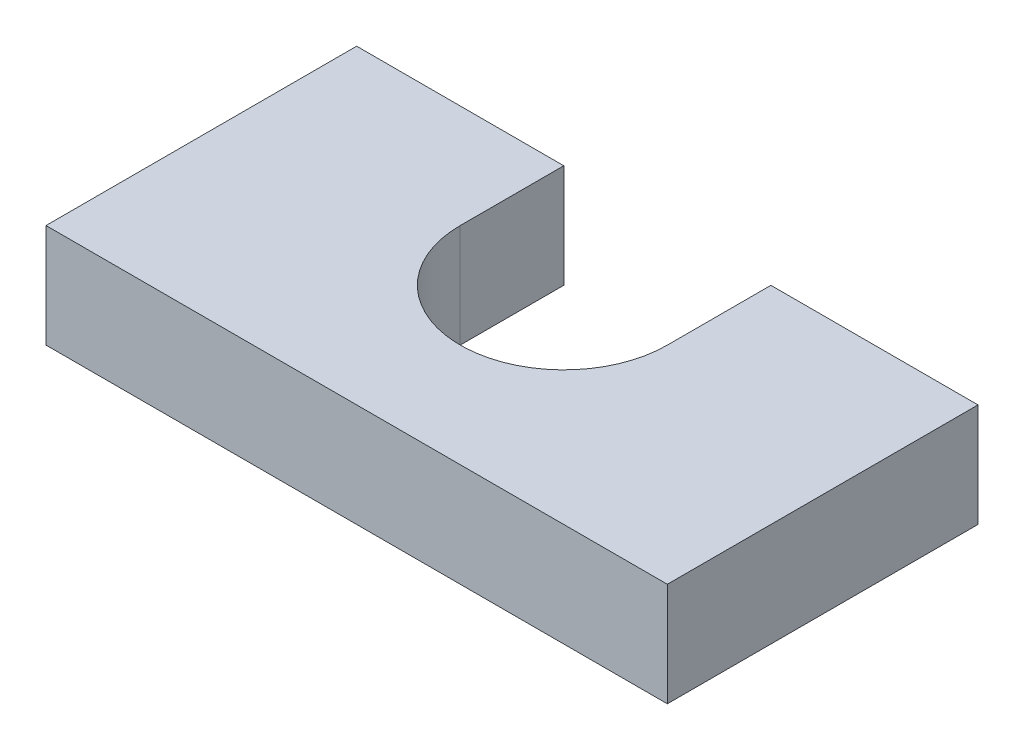
ISO-10303-21;
HEADER;
FILE_DESCRIPTION(('STEP AP214'),'2;1');
FILE_NAME('part.step','',(''),(''),'','','');
FILE_SCHEMA(('AUTOMOTIVE_DESIGN { 1 0 10303 214 1 1 1 1 }'));
ENDSEC;
DATA;
#1=APPLICATION_CONTEXT('core data for automotive mechanical design processes');
#2=APPLICATION_PROTOCOL_DEFINITION('international standard','automotive_design',2000,#1);
#3=PRODUCT_CONTEXT('',#1,'mechanical');
#4=PRODUCT('Part','Part','',(#3));
#5=PRODUCT_RELATED_PRODUCT_CATEGORY('part','',(#4));
#6=PRODUCT_DEFINITION_FORMATION('','',#4);
#7=PRODUCT_DEFINITION_CONTEXT('part definition',#1,'design');
#8=PRODUCT_DEFINITION('design','',#6,#7);
#9=PRODUCT_DEFINITION_SHAPE('','',#8);
#10=(LENGTH_UNIT() NAMED_UNIT(*) SI_UNIT(.MILLI.,.METRE.));
#11=(NAMED_UNIT(*) PLANE_ANGLE_UNIT() SI_UNIT($,.RADIAN.));
#12=(NAMED_UNIT(*) SI_UNIT($,.STERADIAN.) SOLID_ANGLE_UNIT());
#13=UNCERTAINTY_MEASURE_WITH_UNIT(LENGTH_MEASURE(1.E-05),#10,'distance_accuracy_value','');
#14=(GEOMETRIC_REPRESENTATION_CONTEXT(3) GLOBAL_UNCERTAINTY_ASSIGNED_CONTEXT((#13)) GLOBAL_UNIT_ASSIGNED_CONTEXT((#10,
#11,#12)) REPRESENTATION_CONTEXT('',''));
#15=CARTESIAN_POINT('',(0.,0.,0.));
#16=DIRECTION('',(0.,0.,1.));
#17=DIRECTION('',(1.,0.,0.));
#18=AXIS2_PLACEMENT_3D('',#15,#16,#17);
#19=CARTESIAN_POINT('',(-60.,20.,0.));
#20=DIRECTION('',(0.,0.,1.));
#21=DIRECTION('',(1.,0.,0.));
#22=AXIS2_PLACEMENT_3D('',#19,#20,#21);
#23=PLANE('',#22);
#24=DIRECTION('',(-1.,0.,0.));
#25=VECTOR('',#24,1.);
#26=CARTESIAN_POINT('',(-60.,0.,0.));
#27=LINE('',#26,#25);
#28=CARTESIAN_POINT('',(-20.,0.,0.));
#29=VERTEX_POINT('',#28);
#30=CARTESIAN_POINT('',(-60.,0.,0.));
#31=VERTEX_POINT('',#30);
#32=EDGE_CURVE('E133',#29,#31,#27,.T.);
#33=ORIENTED_EDGE('',*,*,#32,.T.);
#34=DIRECTION('',(0.,-1.,0.));
#35=VECTOR('',#34,1.);
#36=CARTESIAN_POINT('',(-60.,20.,0.));
#37=LINE('',#36,#35);
#38=CARTESIAN_POINT('',(-60.,20.,0.));
#39=VERTEX_POINT('',#38);
#40=EDGE_CURVE('E11',#39,#31,#37,.T.);
#41=ORIENTED_EDGE('',*,*,#40,.F.);
#42=DIRECTION('',(-1.,0.,0.));
#43=VECTOR('',#42,1.);
#44=CARTESIAN_POINT('',(-60.,20.,0.));
#45=LINE('',#44,#43);
#46=CARTESIAN_POINT('',(-20.,20.,0.));
#47=VERTEX_POINT('',#46);
#48=EDGE_CURVE('E147',#47,#39,#45,.T.);
#49=ORIENTED_EDGE('',*,*,#48,.F.);
#50=DIRECTION('',(0.,-1.,0.));
#51=VECTOR('',#50,1.);
#52=CARTESIAN_POINT('',(-20.,20.,0.));
#53=LINE('',#52,#51);
#54=EDGE_CURVE('E129',#47,#29,#53,.T.);
#55=ORIENTED_EDGE('',*,*,#54,.T.);
#56=EDGE_LOOP('',(#33,#41,#49,#55));
#57=FACE_BOUND('',#56,.T.);
#58=ADVANCED_FACE('F37',(#57),#23,.F.);
#59=CARTESIAN_POINT('',(-60.,20.,60.));
#60=DIRECTION('',(1.,0.,0.));
#61=DIRECTION('',(0.,0.,-1.));
#62=AXIS2_PLACEMENT_3D('',#59,#60,#61);
#63=PLANE('',#62);
#64=DIRECTION('',(0.,0.,1.));
#65=VECTOR('',#64,1.);
#66=CARTESIAN_POINT('',(-60.,0.,60.));
#67=LINE('',#66,#65);
#68=CARTESIAN_POINT('',(-60.,0.,60.));
#69=VERTEX_POINT('',#68);
#70=EDGE_CURVE('E136',#31,#69,#67,.T.);
#71=ORIENTED_EDGE('',*,*,#70,.T.);
#72=DIRECTION('',(0.,-1.,0.));
#73=VECTOR('',#72,1.);
#74=CARTESIAN_POINT('',(-60.,20.,60.));
#75=LINE('',#74,#73);
#76=CARTESIAN_POINT('',(-60.,20.,60.));
#77=VERTEX_POINT('',#76);
#78=EDGE_CURVE('E45',#77,#69,#75,.T.);
#79=ORIENTED_EDGE('',*,*,#78,.F.);
#80=DIRECTION('',(0.,0.,1.));
#81=VECTOR('',#80,1.);
#82=CARTESIAN_POINT('',(-60.,20.,60.));
#83=LINE('',#82,#81);
#84=EDGE_CURVE('E96',#39,#77,#83,.T.);
#85=ORIENTED_EDGE('',*,*,#84,.F.);
#86=ORIENTED_EDGE('',*,*,#40,.T.);
#87=EDGE_LOOP('',(#71,#79,#85,#86));
#88=FACE_BOUND('',#87,.T.);
#89=ADVANCED_FACE('F182',(#88),#63,.F.);
#90=CARTESIAN_POINT('',(60.,20.,60.));
#91=DIRECTION('',(0.,0.,-1.));
#92=DIRECTION('',(-1.,0.,0.));
#93=AXIS2_PLACEMENT_3D('',#90,#91,#92);
#94=PLANE('',#93);
#95=DIRECTION('',(1.,0.,0.));
#96=VECTOR('',#95,1.);
#97=CARTESIAN_POINT('',(60.,0.,60.));
#98=LINE('',#97,#96);
#99=CARTESIAN_POINT('',(60.,0.,60.));
#100=VERTEX_POINT('',#99);
#101=EDGE_CURVE('E138',#69,#100,#98,.T.);
#102=ORIENTED_EDGE('',*,*,#101,.T.);
#103=DIRECTION('',(0.,-1.,0.));
#104=VECTOR('',#103,1.);
#105=CARTESIAN_POINT('',(60.,20.,60.));
#106=LINE('',#105,#104);
#107=CARTESIAN_POINT('',(60.,20.,60.));
#108=VERTEX_POINT('',#107);
#109=EDGE_CURVE('E154',#108,#100,#106,.T.);
#110=ORIENTED_EDGE('',*,*,#109,.F.);
#111=DIRECTION('',(1.,0.,0.));
#112=VECTOR('',#111,1.);
#113=CARTESIAN_POINT('',(60.,20.,60.));
#114=LINE('',#113,#112);
#115=EDGE_CURVE('E162',#77,#108,#114,.T.);
#116=ORIENTED_EDGE('',*,*,#115,.F.);
#117=ORIENTED_EDGE('',*,*,#78,.T.);
#118=EDGE_LOOP('',(#102,#110,#116,#117));
#119=FACE_BOUND('',#118,.T.);
#120=ADVANCED_FACE('F160',(#119),#94,.F.);
#121=CARTESIAN_POINT('',(60.,20.,60.));
#122=DIRECTION('',(-1.,0.,0.));
#123=DIRECTION('',(0.,0.,1.));
#124=AXIS2_PLACEMENT_3D('',#121,#122,#123);
#125=PLANE('',#124);
#126=DIRECTION('',(0.,0.,-1.));
#127=VECTOR('',#126,1.);
#128=CARTESIAN_POINT('',(60.,0.,60.));
#129=LINE('',#128,#127);
#130=CARTESIAN_POINT('',(60.,0.,0.));
#131=VERTEX_POINT('',#130);
#132=EDGE_CURVE('E140',#100,#131,#129,.T.);
#133=ORIENTED_EDGE('',*,*,#132,.T.);
#134=DIRECTION('',(0.,-1.,0.));
#135=VECTOR('',#134,1.);
#136=CARTESIAN_POINT('',(60.,20.,0.));
#137=LINE('',#136,#135);
#138=CARTESIAN_POINT('',(60.,20.,0.));
#139=VERTEX_POINT('',#138);
#140=EDGE_CURVE('E151',#139,#131,#137,.T.);
#141=ORIENTED_EDGE('',*,*,#140,.F.);
#142=DIRECTION('',(0.,0.,-1.));
#143=VECTOR('',#142,1.);
#144=CARTESIAN_POINT('',(60.,20.,60.));
#145=LINE('',#144,#143);
#146=EDGE_CURVE('E174',#108,#139,#145,.T.);
#147=ORIENTED_EDGE('',*,*,#146,.F.);
#148=ORIENTED_EDGE('',*,*,#109,.T.);
#149=EDGE_LOOP('',(#133,#141,#147,#148));
#150=FACE_BOUND('',#149,.T.);
#151=ADVANCED_FACE('F170',(#150),#125,.F.);
#152=CARTESIAN_POINT('',(60.,20.,0.));
#153=DIRECTION('',(0.,0.,1.));
#154=DIRECTION('',(1.,0.,0.));
#155=AXIS2_PLACEMENT_3D('',#152,#153,#154);
#156=PLANE('',#155);
#157=DIRECTION('',(-1.,0.,0.));
#158=VECTOR('',#157,1.);
#159=CARTESIAN_POINT('',(60.,0.,0.));
#160=LINE('',#159,#158);
#161=CARTESIAN_POINT('',(20.,0.,0.));
#162=VERTEX_POINT('',#161);
#163=EDGE_CURVE('E142',#131,#162,#160,.T.);
#164=ORIENTED_EDGE('',*,*,#163,.T.);
#165=DIRECTION('',(0.,-1.,0.));
#166=VECTOR('',#165,1.);
#167=CARTESIAN_POINT('',(20.,20.,0.));
#168=LINE('',#167,#166);
#169=CARTESIAN_POINT('',(20.,20.,0.));
#170=VERTEX_POINT('',#169);
#171=EDGE_CURVE('E124',#170,#162,#168,.T.);
#172=ORIENTED_EDGE('',*,*,#171,.F.);
#173=DIRECTION('',(-1.,0.,0.));
#174=VECTOR('',#173,1.);
#175=CARTESIAN_POINT('',(60.,20.,0.));
#176=LINE('',#175,#174);
#177=EDGE_CURVE('E115',#139,#170,#176,.T.);
#178=ORIENTED_EDGE('',*,*,#177,.F.);
#179=ORIENTED_EDGE('',*,*,#140,.T.);
#180=EDGE_LOOP('',(#164,#172,#178,#179));
#181=FACE_BOUND('',#180,.T.);
#182=ADVANCED_FACE('F173',(#181),#156,.F.);
#183=CARTESIAN_POINT('',(20.,20.,0.));
#184=DIRECTION('',(1.,0.,0.));
#185=DIRECTION('',(0.,0.,-1.));
#186=AXIS2_PLACEMENT_3D('',#183,#184,#185);
#187=PLANE('',#186);
#188=DIRECTION('',(0.,0.,1.));
#189=VECTOR('',#188,1.);
#190=CARTESIAN_POINT('',(20.,0.,0.));
#191=LINE('',#190,#189);
#192=CARTESIAN_POINT('',(20.,0.,20.));
#193=VERTEX_POINT('',#192);
#194=EDGE_CURVE('E123',#162,#193,#191,.T.);
#195=ORIENTED_EDGE('',*,*,#194,.T.);
#196=DIRECTION('',(0.,-1.,0.));
#197=VECTOR('',#196,1.);
#198=CARTESIAN_POINT('',(20.,20.,20.));
#199=LINE('',#198,#197);
#200=CARTESIAN_POINT('',(20.,20.,20.));
#201=VERTEX_POINT('',#200);
#202=EDGE_CURVE('E120',#201,#193,#199,.T.);
#203=ORIENTED_EDGE('',*,*,#202,.F.);
#204=DIRECTION('',(0.,0.,1.));
#205=VECTOR('',#204,1.);
#206=CARTESIAN_POINT('',(20.,20.,0.));
#207=LINE('',#206,#205);
#208=EDGE_CURVE('E109',#170,#201,#207,.T.);
#209=ORIENTED_EDGE('',*,*,#208,.F.);
#210=ORIENTED_EDGE('',*,*,#171,.T.);
#211=EDGE_LOOP('',(#195,#203,#209,#210));
#212=FACE_BOUND('',#211,.T.);
#213=ADVANCED_FACE('F121',(#212),#187,.F.);
#214=CARTESIAN_POINT('',(0.,20.,20.));
#215=DIRECTION('',(0.,-1.,0.));
#216=DIRECTION('',(0.,0.,-1.));
#217=AXIS2_PLACEMENT_3D('',#214,#215,#216);
#218=CYLINDRICAL_SURFACE('',#217,20.);
#219=CARTESIAN_POINT('',(0.,0.,20.));
#220=DIRECTION('',(0.,-1.,0.));
#221=DIRECTION('',(0.,0.,1.));
#222=AXIS2_PLACEMENT_3D('',#219,#220,#221);
#223=CIRCLE('',#222,20.);
#224=CARTESIAN_POINT('',(-20.,0.,20.));
#225=VERTEX_POINT('',#224);
#226=EDGE_CURVE('E82',#193,#225,#223,.T.);
#227=ORIENTED_EDGE('',*,*,#226,.T.);
#228=DIRECTION('',(0.,-1.,0.));
#229=VECTOR('',#228,1.);
#230=CARTESIAN_POINT('',(-20.,20.,20.));
#231=LINE('',#230,#229);
#232=CARTESIAN_POINT('',(-20.,20.,20.));
#233=VERTEX_POINT('',#232);
#234=EDGE_CURVE('E125',#233,#225,#231,.T.);
#235=ORIENTED_EDGE('',*,*,#234,.F.);
#236=CARTESIAN_POINT('',(0.,20.,20.));
#237=DIRECTION('',(0.,-1.,0.));
#238=DIRECTION('',(0.,0.,1.));
#239=AXIS2_PLACEMENT_3D('',#236,#237,#238);
#240=CIRCLE('',#239,20.);
#241=EDGE_CURVE('E113',#201,#233,#240,.T.);
#242=ORIENTED_EDGE('',*,*,#241,.F.);
#243=ORIENTED_EDGE('',*,*,#202,.T.);
#244=EDGE_LOOP('',(#227,#235,#242,#243));
#245=FACE_BOUND('',#244,.T.);
#246=ADVANCED_FACE('F127',(#245),#218,.F.);
#247=CARTESIAN_POINT('',(-20.,20.,0.));
#248=DIRECTION('',(-1.,0.,0.));
#249=DIRECTION('',(0.,0.,1.));
#250=AXIS2_PLACEMENT_3D('',#247,#248,#249);
#251=PLANE('',#250);
#252=DIRECTION('',(0.,0.,-1.));
#253=VECTOR('',#252,1.);
#254=CARTESIAN_POINT('',(-20.,0.,0.));
#255=LINE('',#254,#253);
#256=EDGE_CURVE('E88',#225,#29,#255,.T.);
#257=ORIENTED_EDGE('',*,*,#256,.T.);
#258=ORIENTED_EDGE('',*,*,#54,.F.);
#259=DIRECTION('',(0.,0.,-1.));
#260=VECTOR('',#259,1.);
#261=CARTESIAN_POINT('',(-20.,20.,0.));
#262=LINE('',#261,#260);
#263=EDGE_CURVE('E53',#233,#47,#262,.T.);
#264=ORIENTED_EDGE('',*,*,#263,.F.);
#265=ORIENTED_EDGE('',*,*,#234,.T.);
#266=EDGE_LOOP('',(#257,#258,#264,#265));
#267=FACE_BOUND('',#266,.T.);
#268=ADVANCED_FACE('F198',(#267),#251,.F.);
#269=CARTESIAN_POINT('',(0.,20.,20.));
#270=DIRECTION('',(0.,1.,0.));
#271=DIRECTION('',(0.,0.,1.));
#272=AXIS2_PLACEMENT_3D('',#269,#270,#271);
#273=PLANE('',#272);
#274=ORIENTED_EDGE('',*,*,#48,.T.);
#275=ORIENTED_EDGE('',*,*,#84,.T.);
#276=ORIENTED_EDGE('',*,*,#115,.T.);
#277=ORIENTED_EDGE('',*,*,#146,.T.);
#278=ORIENTED_EDGE('',*,*,#177,.T.);
#279=ORIENTED_EDGE('',*,*,#208,.T.);
#280=ORIENTED_EDGE('',*,*,#241,.T.);
#281=ORIENTED_EDGE('',*,*,#263,.T.);
#282=EDGE_LOOP('',(#274,#275,#276,#277,#278,#279,#280,#281));
#283=FACE_BOUND('',#282,.T.);
#284=ADVANCED_FACE('F111',(#283),#273,.T.);
#285=CARTESIAN_POINT('',(0.,0.,20.));
#286=DIRECTION('',(0.,1.,0.));
#287=DIRECTION('',(0.,0.,1.));
#288=AXIS2_PLACEMENT_3D('',#285,#286,#287);
#289=PLANE('',#288);
#290=ORIENTED_EDGE('',*,*,#32,.F.);
#291=ORIENTED_EDGE('',*,*,#256,.F.);
#292=ORIENTED_EDGE('',*,*,#226,.F.);
#293=ORIENTED_EDGE('',*,*,#194,.F.);
#294=ORIENTED_EDGE('',*,*,#163,.F.);
#295=ORIENTED_EDGE('',*,*,#132,.F.);
#296=ORIENTED_EDGE('',*,*,#101,.F.);
#297=ORIENTED_EDGE('',*,*,#70,.F.);
#298=EDGE_LOOP('',(#290,#291,#292,#293,#294,#295,#296,#297));
#299=FACE_BOUND('',#298,.T.);
#300=ADVANCED_FACE('F166',(#299),#289,.F.);
#301=CLOSED_SHELL('',(#58,#89,#120,#151,#182,#213,#246,#268,#284,#300));
#302=MANIFOLD_SOLID_BREP('B2',#301);
#303=ADVANCED_BREP_SHAPE_REPRESENTATION('',(#18,#302),#14);
#304=SHAPE_DEFINITION_REPRESENTATION(#9,#303);
ENDSEC;
END-ISO-10303-21;
